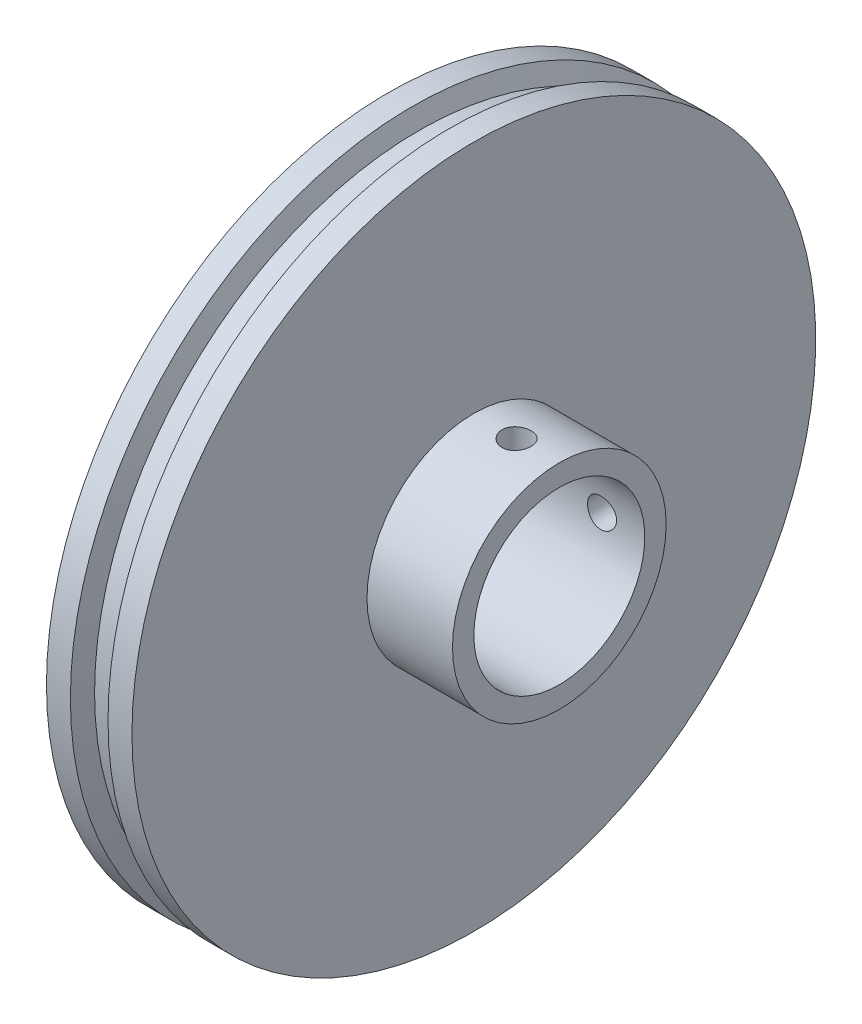
ISO-10303-21;
HEADER;
FILE_DESCRIPTION(('STEP AP214'),'2;1');
FILE_NAME('part.step','',(''),(''),'','','');
FILE_SCHEMA(('AUTOMOTIVE_DESIGN { 1 0 10303 214 1 1 1 1 }'));
ENDSEC;
DATA;
#1=APPLICATION_CONTEXT('core data for automotive mechanical design processes');
#2=APPLICATION_PROTOCOL_DEFINITION('international standard','automotive_design',2000,#1);
#3=PRODUCT_CONTEXT('',#1,'mechanical');
#4=PRODUCT('Part','Part','',(#3));
#5=PRODUCT_RELATED_PRODUCT_CATEGORY('part','',(#4));
#6=PRODUCT_DEFINITION_FORMATION('','',#4);
#7=PRODUCT_DEFINITION_CONTEXT('part definition',#1,'design');
#8=PRODUCT_DEFINITION('design','',#6,#7);
#9=PRODUCT_DEFINITION_SHAPE('','',#8);
#10=(LENGTH_UNIT() NAMED_UNIT(*) SI_UNIT(.MILLI.,.METRE.));
#11=(NAMED_UNIT(*) PLANE_ANGLE_UNIT() SI_UNIT($,.RADIAN.));
#12=(NAMED_UNIT(*) SI_UNIT($,.STERADIAN.) SOLID_ANGLE_UNIT());
#13=UNCERTAINTY_MEASURE_WITH_UNIT(LENGTH_MEASURE(1.E-05),#10,'distance_accuracy_value','');
#14=(GEOMETRIC_REPRESENTATION_CONTEXT(3) GLOBAL_UNCERTAINTY_ASSIGNED_CONTEXT((#13)) GLOBAL_UNIT_ASSIGNED_CONTEXT((#10,
#11,#12)) REPRESENTATION_CONTEXT('',''));
#15=CARTESIAN_POINT('',(0.,0.,0.));
#16=DIRECTION('',(0.,0.,1.));
#17=DIRECTION('',(1.,0.,0.));
#18=AXIS2_PLACEMENT_3D('',#15,#16,#17);
#19=CARTESIAN_POINT('',(-5.,0.,0.));
#20=DIRECTION('',(-1.,0.,0.));
#21=DIRECTION('',(0.,0.,1.));
#22=AXIS2_PLACEMENT_3D('',#19,#20,#21);
#23=CYLINDRICAL_SURFACE('',#22,12.5);
#24=CARTESIAN_POINT('',(5.,0.,0.));
#25=DIRECTION('',(-1.,0.,0.));
#26=DIRECTION('',(0.,0.,1.));
#27=AXIS2_PLACEMENT_3D('',#24,#25,#26);
#28=CIRCLE('',#27,12.5);
#29=CARTESIAN_POINT('',(5.,0.,12.5));
#30=VERTEX_POINT('',#29);
#31=EDGE_CURVE('E81',#30,#30,#28,.T.);
#32=ORIENTED_EDGE('',*,*,#31,.F.);
#33=EDGE_LOOP('',(#32));
#34=FACE_BOUND('',#33,.T.);
#35=CARTESIAN_POINT('',(15.,0.,0.));
#36=DIRECTION('',(-1.,0.,0.));
#37=DIRECTION('',(0.,0.,1.));
#38=AXIS2_PLACEMENT_3D('',#35,#36,#37);
#39=CIRCLE('',#38,12.5);
#40=CARTESIAN_POINT('',(15.,0.,12.5));
#41=VERTEX_POINT('',#40);
#42=EDGE_CURVE('E10',#41,#41,#39,.T.);
#43=ORIENTED_EDGE('',*,*,#42,.T.);
#44=EDGE_LOOP('',(#43));
#45=FACE_BOUND('',#44,.T.);
#46=CARTESIAN_POINT('',(8.3,12.5,0.));
#47=CARTESIAN_POINT('',(8.30000399049848,12.4999985824937,0.0950193693737273));
#48=CARTESIAN_POINT('',(8.30799335860235,12.4989051524507,0.190096346810551));
#49=CARTESIAN_POINT('',(8.33973558100916,12.4946484420949,0.377599668031956));
#50=CARTESIAN_POINT('',(8.36350443099154,12.4914830614891,0.470023222755468));
#51=CARTESIAN_POINT('',(8.42608811753651,12.4834386800685,0.649478453993375));
#52=CARTESIAN_POINT('',(8.46489230343678,12.4785608925101,0.73651389681058));
#53=CARTESIAN_POINT('',(8.55642067336079,12.4676327325641,0.902822437619665));
#54=CARTESIAN_POINT('',(8.60914266070609,12.461582545259,0.982096757862896));
#55=CARTESIAN_POINT('',(8.72737428453399,12.4489401706774,1.1311609905647));
#56=CARTESIAN_POINT('',(8.79295610205747,12.4423450516135,1.20089340927839));
#57=CARTESIAN_POINT('',(8.93489058333537,12.4293794703064,1.32839884646825));
#58=CARTESIAN_POINT('',(9.01124382407019,12.4230090201206,1.38617122388536));
#59=CARTESIAN_POINT('',(9.17293294201966,12.4111854302546,1.48833501602162));
#60=CARTESIAN_POINT('',(9.25830363935377,12.4057360746105,1.53267179858357));
#61=CARTESIAN_POINT('',(9.43536596920943,12.3964109917819,1.60635685826283));
#62=CARTESIAN_POINT('',(9.5270573184181,12.3925351941187,1.63570580669007));
#63=CARTESIAN_POINT('',(9.71355783465852,12.3868244616918,1.67840568904312));
#64=CARTESIAN_POINT('',(9.80834424651759,12.3849770693856,1.69185431515497));
#65=CARTESIAN_POINT('',(9.9988451896524,12.3834943395339,1.70267423628677));
#66=CARTESIAN_POINT('',(10.0945596767459,12.3838588971968,1.70004629293772));
#67=CARTESIAN_POINT('',(10.2835151005745,12.3867474777825,1.6788677145159));
#68=CARTESIAN_POINT('',(10.3767684103706,12.389256838664,1.66042518638892));
#69=CARTESIAN_POINT('',(10.5588443269562,12.3961294042073,1.60830986035059));
#70=CARTESIAN_POINT('',(10.647666828938,12.4004926526983,1.5746367023588));
#71=CARTESIAN_POINT('',(10.8186927336821,12.4105978157081,1.49290135454795));
#72=CARTESIAN_POINT('',(10.900873649633,12.4163441716624,1.44479268408233));
#73=CARTESIAN_POINT('',(11.0560369845012,12.4285647481879,1.33558512659794));
#74=CARTESIAN_POINT('',(11.1290189056233,12.4350390081132,1.27448553706776));
#75=CARTESIAN_POINT('',(11.264339663579,12.4480509280862,1.14043378959507));
#76=CARTESIAN_POINT('',(11.3265863165472,12.4545886726739,1.06738854593132));
#77=CARTESIAN_POINT('',(11.4379501383685,12.4669414130603,0.911838118562529));
#78=CARTESIAN_POINT('',(11.4870672666848,12.4727564066275,0.829332905651348));
#79=CARTESIAN_POINT('',(11.5707797967884,12.483013039657,0.657129787303393));
#80=CARTESIAN_POINT('',(11.6053688667713,12.4874540800839,0.567428765939401));
#81=CARTESIAN_POINT('',(11.6589673436249,12.4944571938052,0.383417754602683));
#82=CARTESIAN_POINT('',(11.6779776148745,12.4970193713461,0.289108020648868));
#83=CARTESIAN_POINT('',(11.6997580896896,12.4999624166332,0.099353143737758));
#84=CARTESIAN_POINT('',(11.7026551736488,12.5003603259693,0.00392281856572002));
#85=CARTESIAN_POINT('',(11.6924626868127,12.4989761709545,-0.186062088343098));
#86=CARTESIAN_POINT('',(11.6793735206688,12.4971941617827,-0.280616692185505));
#87=CARTESIAN_POINT('',(11.6376855428029,12.4916609697489,-0.465787556296885));
#88=CARTESIAN_POINT('',(11.6091477811237,12.4879175399217,-0.556417812371648));
#89=CARTESIAN_POINT('',(11.537436545087,12.478880270856,-0.731606674242914));
#90=CARTESIAN_POINT('',(11.4942624921698,12.47358637033,-0.816165039862857));
#91=CARTESIAN_POINT('',(11.3942011480688,12.4619950790423,-0.977372840274131));
#92=CARTESIAN_POINT('',(11.3372324452297,12.455691809023,-1.05397131280997));
#93=CARTESIAN_POINT('',(11.211313337348,12.4428038405337,-1.19656515527526));
#94=CARTESIAN_POINT('',(11.1423623653937,12.4362191287592,-1.26256002323669));
#95=CARTESIAN_POINT('',(10.9938745408483,12.4234572170661,-1.38252830907401));
#96=CARTESIAN_POINT('',(10.9142691068428,12.4172830816708,-1.43641721633323));
#97=CARTESIAN_POINT('',(10.7470621534232,12.4060934325306,-1.53005854518823));
#98=CARTESIAN_POINT('',(10.6594608185572,12.4010778920545,-1.56981129294775));
#99=CARTESIAN_POINT('',(10.4790127566732,12.3927947776081,-1.63391747298213));
#100=CARTESIAN_POINT('',(10.3861827355514,12.3895219509384,-1.65831722146991));
#101=CARTESIAN_POINT('',(10.1976952821839,12.3850802367668,-1.69117325627899));
#102=CARTESIAN_POINT('',(10.1020380081,12.3839112317988,-1.69963043274914));
#103=CARTESIAN_POINT('',(9.9114527750082,12.383813359009,-1.700342891897));
#104=CARTESIAN_POINT('',(9.81652529481145,12.3848661289696,-1.69273097999286));
#105=CARTESIAN_POINT('',(9.6293129579314,12.3890535297788,-1.66180397404756));
#106=CARTESIAN_POINT('',(9.53702809980375,12.3921881594894,-1.63848888858925));
#107=CARTESIAN_POINT('',(9.35774624949746,12.4001800965893,-1.57686121095053));
#108=CARTESIAN_POINT('',(9.27074659781941,12.4050365290199,-1.53855623507271));
#109=CARTESIAN_POINT('',(9.10438783045148,12.415926146482,-1.44804917472723));
#110=CARTESIAN_POINT('',(9.02502887946664,12.4219593568718,-1.39584679077452));
#111=CARTESIAN_POINT('',(8.87552693820758,12.4345823449606,-1.27853812678782));
#112=CARTESIAN_POINT('',(8.80546177668758,12.4411761460865,-1.21333308331974));
#113=CARTESIAN_POINT('',(8.6772188219195,12.4541426300155,-1.07207782751908));
#114=CARTESIAN_POINT('',(8.6190438167913,12.4605152606662,-0.99602507859291));
#115=CARTESIAN_POINT('',(8.51600454347844,12.4723535628891,-0.834836006102762));
#116=CARTESIAN_POINT('',(8.47120129412887,12.4778150281094,-0.74966038144764));
#117=CARTESIAN_POINT('',(8.3966005793095,12.4871737590591,-0.572963876241477));
#118=CARTESIAN_POINT('',(8.36678712612197,12.4910726904407,-0.481449875112423));
#119=CARTESIAN_POINT('',(8.32999391075147,12.4959478797449,-0.324573117820287));
#120=CARTESIAN_POINT('',(8.31876278159852,12.4974598558217,-0.260191415281782));
#121=CARTESIAN_POINT('',(8.30376449010305,12.4994863982821,-0.130548868797499));
#122=CARTESIAN_POINT('',(8.29999725811908,12.5000009739719,-0.065288033060141));
#123=CARTESIAN_POINT('',(8.3,12.5,0.));
#124=B_SPLINE_CURVE_WITH_KNOTS('',3,(#46,#47,#48,#49,#50,#51,#52,#53,#54,#55,#56,#57,#58,#59,
#60,#61,#62,#63,#64,#65,#66,#67,#68,#69,#70,#71,#72,#73,#74,#75,#76,#77,#78,#79,#80,#81,#82,#83,
#84,#85,#86,#87,#88,#89,#90,#91,#92,#93,#94,#95,#96,#97,#98,#99,#100,#101,#102,#103,#104,#105,
#106,#107,#108,#109,#110,#111,#112,#113,#114,#115,#116,#117,#118,#119,#120,#121,#122,#123),
.UNSPECIFIED.,.T.,.F.,(4,2,2,2,2,2,2,2,2,2,2,2,2,2,2,2,2,2,2,2,2,2,2,2,2,2,2,2,2,2,2,2,2,2,2,2,
2,2,4),(0.,0.284819593615374,0.56992835095583,0.854835512412447,1.13969773317749,
1.42620715431877,1.71273192841171,2.00040660874572,2.28806840290729,2.57395345239702,
2.85982495812473,3.14375771237637,3.42769717967764,3.712560892306,3.9974400134613,
4.28465522208686,4.57187131746728,4.85921246147866,5.14653766148729,5.43159713304083,
5.71664938918519,6.00058330751292,6.28452845080429,6.57019204001725,6.85586914838449,
7.14348251733643,7.4310892497516,7.71782413052423,8.00454300106438,8.28890152089469,
8.57325988530359,8.85747395558084,9.14169415108319,9.42816158283325,9.71469611138847,
10.0025188538507,10.2900339575411,10.4857359988361,10.6814362141364),.UNSPECIFIED.);
#125=CARTESIAN_POINT('',(8.3,12.5,0.));
#126=VERTEX_POINT('',#125);
#127=EDGE_CURVE('E59',#126,#126,#124,.T.);
#128=ORIENTED_EDGE('',*,*,#127,.F.);
#129=EDGE_LOOP('',(#128));
#130=FACE_BOUND('',#129,.T.);
#131=CARTESIAN_POINT('',(8.3,0.,-12.5));
#132=CARTESIAN_POINT('',(8.30000399049848,0.0950193693736837,-12.4999985824937));
#133=CARTESIAN_POINT('',(8.30799335860235,0.190096346810507,-12.4989051524507));
#134=CARTESIAN_POINT('',(8.33973558100916,0.377599668031912,-12.4946484420949));
#135=CARTESIAN_POINT('',(8.36350443099154,0.470023222755424,-12.4914830614891));
#136=CARTESIAN_POINT('',(8.42608811753651,0.649478453993332,-12.4834386800686));
#137=CARTESIAN_POINT('',(8.46489230343678,0.736513896810536,-12.4785608925101));
#138=CARTESIAN_POINT('',(8.55642067336079,0.902822437619622,-12.4676327325641));
#139=CARTESIAN_POINT('',(8.60914266070609,0.982096757862853,-12.461582545259));
#140=CARTESIAN_POINT('',(8.72737428453399,1.13116099056465,-12.4489401706774));
#141=CARTESIAN_POINT('',(8.79295610205747,1.20089340927835,-12.4423450516135));
#142=CARTESIAN_POINT('',(8.93489058333537,1.32839884646821,-12.4293794703064));
#143=CARTESIAN_POINT('',(9.01124382407019,1.38617122388531,-12.4230090201206));
#144=CARTESIAN_POINT('',(9.17293294201966,1.48833501602157,-12.4111854302546));
#145=CARTESIAN_POINT('',(9.25830363935377,1.53267179858353,-12.4057360746105));
#146=CARTESIAN_POINT('',(9.43536596920943,1.60635685826278,-12.3964109917819));
#147=CARTESIAN_POINT('',(9.5270573184181,1.63570580669003,-12.3925351941188));
#148=CARTESIAN_POINT('',(9.71355783465852,1.67840568904308,-12.3868244616918));
#149=CARTESIAN_POINT('',(9.80834424651759,1.69185431515493,-12.3849770693856));
#150=CARTESIAN_POINT('',(9.9988451896524,1.70267423628672,-12.3834943395339));
#151=CARTESIAN_POINT('',(10.0945596767459,1.70004629293768,-12.3838588971968));
#152=CARTESIAN_POINT('',(10.2835151005745,1.67886771451586,-12.3867474777825));
#153=CARTESIAN_POINT('',(10.3767684103706,1.66042518638888,-12.389256838664));
#154=CARTESIAN_POINT('',(10.5588443269562,1.60830986035055,-12.3961294042073));
#155=CARTESIAN_POINT('',(10.647666828938,1.57463670235876,-12.4004926526983));
#156=CARTESIAN_POINT('',(10.8186927336821,1.49290135454791,-12.4105978157081));
#157=CARTESIAN_POINT('',(10.900873649633,1.44479268408229,-12.4163441716624));
#158=CARTESIAN_POINT('',(11.0560369845012,1.33558512659789,-12.4285647481879));
#159=CARTESIAN_POINT('',(11.1290189056233,1.27448553706771,-12.4350390081132));
#160=CARTESIAN_POINT('',(11.264339663579,1.14043378959502,-12.4480509280862));
#161=CARTESIAN_POINT('',(11.3265863165472,1.06738854593127,-12.454588672674));
#162=CARTESIAN_POINT('',(11.4379501383685,0.911838118562486,-12.4669414130603));
#163=CARTESIAN_POINT('',(11.4870672666848,0.829332905651305,-12.4727564066275));
#164=CARTESIAN_POINT('',(11.5707797967884,0.657129787303349,-12.483013039657));
#165=CARTESIAN_POINT('',(11.6053688667713,0.567428765939357,-12.4874540800839));
#166=CARTESIAN_POINT('',(11.6589673436249,0.383417754602639,-12.4944571938052));
#167=CARTESIAN_POINT('',(11.6779776148745,0.289108020648824,-12.4970193713461));
#168=CARTESIAN_POINT('',(11.6997580896896,0.0993531437377146,-12.4999624166332));
#169=CARTESIAN_POINT('',(11.7026551736488,0.00392281856567651,-12.5003603259693));
#170=CARTESIAN_POINT('',(11.6924626868127,-0.186062088343141,-12.4989761709545));
#171=CARTESIAN_POINT('',(11.6793735206688,-0.280616692185548,-12.4971941617827));
#172=CARTESIAN_POINT('',(11.6376855428029,-0.465787556296929,-12.4916609697489));
#173=CARTESIAN_POINT('',(11.6091477811237,-0.556417812371691,-12.4879175399217));
#174=CARTESIAN_POINT('',(11.537436545087,-0.731606674242958,-12.478880270856));
#175=CARTESIAN_POINT('',(11.4942624921698,-0.8161650398629,-12.47358637033));
#176=CARTESIAN_POINT('',(11.3942011480688,-0.977372840274175,-12.4619950790423));
#177=CARTESIAN_POINT('',(11.3372324452297,-1.05397131281001,-12.455691809023));
#178=CARTESIAN_POINT('',(11.211313337348,-1.19656515527531,-12.4428038405337));
#179=CARTESIAN_POINT('',(11.1423623653937,-1.26256002323674,-12.4362191287591));
#180=CARTESIAN_POINT('',(10.9938745408483,-1.38252830907405,-12.4234572170661));
#181=CARTESIAN_POINT('',(10.9142691068428,-1.43641721633328,-12.4172830816708));
#182=CARTESIAN_POINT('',(10.7470621534232,-1.53005854518827,-12.4060934325306));
#183=CARTESIAN_POINT('',(10.6594608185572,-1.56981129294779,-12.4010778920545));
#184=CARTESIAN_POINT('',(10.4790127566732,-1.63391747298217,-12.3927947776081));
#185=CARTESIAN_POINT('',(10.3861827355514,-1.65831722146995,-12.3895219509384));
#186=CARTESIAN_POINT('',(10.1976952821839,-1.69117325627904,-12.3850802367668));
#187=CARTESIAN_POINT('',(10.1020380081,-1.69963043274918,-12.3839112317988));
#188=CARTESIAN_POINT('',(9.9114527750082,-1.70034289189704,-12.383813359009));
#189=CARTESIAN_POINT('',(9.81652529481145,-1.69273097999291,-12.3848661289696));
#190=CARTESIAN_POINT('',(9.6293129579314,-1.6618039740476,-12.3890535297788));
#191=CARTESIAN_POINT('',(9.53702809980375,-1.63848888858929,-12.3921881594894));
#192=CARTESIAN_POINT('',(9.35774624949746,-1.57686121095058,-12.4001800965892));
#193=CARTESIAN_POINT('',(9.27074659781941,-1.53855623507276,-12.4050365290199));
#194=CARTESIAN_POINT('',(9.10438783045148,-1.44804917472727,-12.415926146482));
#195=CARTESIAN_POINT('',(9.02502887946664,-1.39584679077457,-12.4219593568718));
#196=CARTESIAN_POINT('',(8.87552693820758,-1.27853812678787,-12.4345823449606));
#197=CARTESIAN_POINT('',(8.80546177668758,-1.21333308331979,-12.4411761460865));
#198=CARTESIAN_POINT('',(8.6772188219195,-1.07207782751913,-12.4541426300155));
#199=CARTESIAN_POINT('',(8.6190438167913,-0.996025078592954,-12.4605152606662));
#200=CARTESIAN_POINT('',(8.51600454347844,-0.834836006102806,-12.4723535628891));
#201=CARTESIAN_POINT('',(8.47120129412887,-0.749660381447684,-12.4778150281094));
#202=CARTESIAN_POINT('',(8.3966005793095,-0.572963876241521,-12.4871737590591));
#203=CARTESIAN_POINT('',(8.36678712612197,-0.481449875112467,-12.4910726904407));
#204=CARTESIAN_POINT('',(8.32999391075147,-0.324573117820331,-12.4959478797449));
#205=CARTESIAN_POINT('',(8.31876278159852,-0.260191415281826,-12.4974598558217));
#206=CARTESIAN_POINT('',(8.30376449010305,-0.130548868797543,-12.4994863982821));
#207=CARTESIAN_POINT('',(8.29999725811908,-0.0652880330601847,-12.5000009739719));
#208=CARTESIAN_POINT('',(8.3,0.,-12.5));
#209=B_SPLINE_CURVE_WITH_KNOTS('',3,(#131,#132,#133,#134,#135,#136,#137,#138,#139,#140,#141,
#142,#143,#144,#145,#146,#147,#148,#149,#150,#151,#152,#153,#154,#155,#156,#157,#158,#159,#160,
#161,#162,#163,#164,#165,#166,#167,#168,#169,#170,#171,#172,#173,#174,#175,#176,#177,#178,#179,
#180,#181,#182,#183,#184,#185,#186,#187,#188,#189,#190,#191,#192,#193,#194,#195,#196,#197,#198,
#199,#200,#201,#202,#203,#204,#205,#206,#207,#208),.UNSPECIFIED.,.T.,.F.,(4,2,2,2,2,2,2,2,2,2,2,
2,2,2,2,2,2,2,2,2,2,2,2,2,2,2,2,2,2,2,2,2,2,2,2,2,2,2,4),(0.,0.284819593615374,0.56992835095583,
0.854835512412447,1.13969773317749,1.42620715431877,1.71273192841171,2.00040660874572,
2.28806840290729,2.57395345239702,2.85982495812473,3.14375771237637,3.42769717967764,
3.712560892306,3.9974400134613,4.28465522208686,4.57187131746728,4.85921246147866,
5.14653766148729,5.43159713304083,5.71664938918519,6.00058330751292,6.28452845080429,
6.57019204001725,6.85586914838449,7.14348251733643,7.43108924975161,7.71782413052423,
8.00454300106438,8.2889015208947,8.57325988530359,8.85747395558084,9.14169415108319,
9.42816158283325,9.71469611138847,10.0025188538507,10.2900339575411,10.4857359988361,
10.6814362141364),.UNSPECIFIED.);
#210=CARTESIAN_POINT('',(8.3,0.,-12.5));
#211=VERTEX_POINT('',#210);
#212=EDGE_CURVE('E60',#211,#211,#209,.T.);
#213=ORIENTED_EDGE('',*,*,#212,.F.);
#214=EDGE_LOOP('',(#213));
#215=FACE_BOUND('',#214,.T.);
#216=ADVANCED_FACE('F32',(#34,#45,#130,#215),#23,.T.);
#217=CARTESIAN_POINT('',(-5.,0.,0.));
#218=DIRECTION('',(-1.,0.,0.));
#219=DIRECTION('',(0.,0.,1.));
#220=AXIS2_PLACEMENT_3D('',#217,#218,#219);
#221=CYLINDRICAL_SURFACE('',#220,10.);
#222=CARTESIAN_POINT('',(15.,0.,0.));
#223=DIRECTION('',(-1.,0.,0.));
#224=DIRECTION('',(0.,0.,1.));
#225=AXIS2_PLACEMENT_3D('',#222,#223,#224);
#226=CIRCLE('',#225,10.);
#227=CARTESIAN_POINT('',(15.,0.,10.));
#228=VERTEX_POINT('',#227);
#229=EDGE_CURVE('E45',#228,#228,#226,.T.);
#230=ORIENTED_EDGE('',*,*,#229,.F.);
#231=EDGE_LOOP('',(#230));
#232=FACE_BOUND('',#231,.T.);
#233=CARTESIAN_POINT('',(-5.,0.,0.));
#234=DIRECTION('',(-1.,0.,0.));
#235=DIRECTION('',(0.,0.,1.));
#236=AXIS2_PLACEMENT_3D('',#233,#234,#235);
#237=CIRCLE('',#236,10.);
#238=CARTESIAN_POINT('',(-5.,0.,10.));
#239=VERTEX_POINT('',#238);
#240=EDGE_CURVE('E50',#239,#239,#237,.T.);
#241=ORIENTED_EDGE('',*,*,#240,.T.);
#242=EDGE_LOOP('',(#241));
#243=FACE_BOUND('',#242,.T.);
#244=CARTESIAN_POINT('',(8.3,10.,0.));
#245=CARTESIAN_POINT('',(8.30000377426823,9.99999835850477,-0.0947576878946055));
#246=CARTESIAN_POINT('',(8.3079494293732,9.99863913653262,-0.189566391791717));
#247=CARTESIAN_POINT('',(8.33950779581302,9.99334783512617,-0.376522793597834));
#248=CARTESIAN_POINT('',(8.3631347336332,9.98941341945108,-0.468667995816793));
#249=CARTESIAN_POINT('',(8.4253200785672,9.97941284762061,-0.647565634171713));
#250=CARTESIAN_POINT('',(8.46386607640266,9.97334846350343,-0.734322482783481));
#251=CARTESIAN_POINT('',(8.55476244084402,9.95975405257941,-0.900126684803733));
#252=CARTESIAN_POINT('',(8.60711129965871,9.95222418588187,-0.979174878995801));
#253=CARTESIAN_POINT('',(8.72468015800242,9.93644939291957,-1.12811339489271));
#254=CARTESIAN_POINT('',(8.79001042782126,9.92819870569956,-1.19791607072673));
#255=CARTESIAN_POINT('',(8.93145028967449,9.91195606359551,-1.3256248419945));
#256=CARTESIAN_POINT('',(9.00756057528767,9.90396412539988,-1.38353017137327));
#257=CARTESIAN_POINT('',(9.16900471159843,9.88908804024087,-1.48615381918914));
#258=CARTESIAN_POINT('',(9.25439464291669,9.88221133503736,-1.53078508643947));
#259=CARTESIAN_POINT('',(9.43159610594252,9.87042444664235,-1.60503692511557));
#260=CARTESIAN_POINT('',(9.52340718532692,9.86551412509698,-1.63465855265173));
#261=CARTESIAN_POINT('',(9.70991431831559,9.85827341734443,-1.67777332304485));
#262=CARTESIAN_POINT('',(9.80457437839511,9.85591880382118,-1.69141802151835));
#263=CARTESIAN_POINT('',(9.99486742648253,9.85398286044504,-1.70266159018217));
#264=CARTESIAN_POINT('',(10.0905003423385,9.8544013264024,-1.70026164178552));
#265=CARTESIAN_POINT('',(10.2789401126245,9.85794215005271,-1.67960740432418));
#266=CARTESIAN_POINT('',(10.3717662886004,9.86103541731158,-1.66152368158915));
#267=CARTESIAN_POINT('',(10.553047603891,9.86953175017028,-1.6102830462488));
#268=CARTESIAN_POINT('',(10.641502587653,9.87493489790323,-1.57712559765967));
#269=CARTESIAN_POINT('',(10.8120394633763,9.88747346302157,-1.49650673760764));
#270=CARTESIAN_POINT('',(10.8940873626616,9.89461738721263,-1.44897479731415));
#271=CARTESIAN_POINT('',(11.0491073586138,9.90982670315991,-1.34100625557331));
#272=CARTESIAN_POINT('',(11.1220786930608,9.91789217219545,-1.2805685715006));
#273=CARTESIAN_POINT('',(11.2578612153225,9.93416346380999,-1.14757629513502));
#274=CARTESIAN_POINT('',(11.320529165259,9.94236975461281,-1.07487542689003));
#275=CARTESIAN_POINT('',(11.4327985550483,9.95790194047775,-0.91991440278867));
#276=CARTESIAN_POINT('',(11.482399904278,9.96522782943365,-0.837654180639251));
#277=CARTESIAN_POINT('',(11.5671423471008,9.97818481552786,-0.665772592595594));
#278=CARTESIAN_POINT('',(11.6022704457055,9.98381438839473,-0.576144697761931));
#279=CARTESIAN_POINT('',(11.6569344968132,9.99273228163516,-0.392144072691741));
#280=CARTESIAN_POINT('',(11.6764718070531,9.9960208058782,-0.297771756388136));
#281=CARTESIAN_POINT('',(11.6992047217622,9.99985857062862,-0.108195402995361));
#282=CARTESIAN_POINT('',(11.7025969038369,10.0004407604978,-0.0130155823423567));
#283=CARTESIAN_POINT('',(11.6934678440613,9.99889062262385,0.176552208617399));
#284=CARTESIAN_POINT('',(11.6809472401301,9.99675840369713,0.270940210514255));
#285=CARTESIAN_POINT('',(11.6405115192946,9.9900394441558,0.455635354346481));
#286=CARTESIAN_POINT('',(11.612694051989,9.98546827833647,0.545964490519938));
#287=CARTESIAN_POINT('',(11.5425585774746,9.97438190041171,0.720677070626036));
#288=CARTESIAN_POINT('',(11.5002397288841,9.96786657550744,0.805060169222211));
#289=CARTESIAN_POINT('',(11.4018548591596,9.95353279680435,0.966336947941808));
#290=CARTESIAN_POINT('',(11.3456664517532,9.94570295183439,1.04315493575005));
#291=CARTESIAN_POINT('',(11.2213053793328,9.92964218696026,1.18634178293015));
#292=CARTESIAN_POINT('',(11.1531318063952,9.92141123670495,1.25270984995668));
#293=CARTESIAN_POINT('',(11.0058526439188,9.90536897279411,1.37384438851324));
#294=CARTESIAN_POINT('',(10.9266369481539,9.89756315078007,1.42847783237172));
#295=CARTESIAN_POINT('',(10.7600369358385,9.88335868818869,1.52366227424996));
#296=CARTESIAN_POINT('',(10.6726528858138,9.87696000172068,1.56421373154811));
#297=CARTESIAN_POINT('',(10.4925634017548,9.86633579141612,1.62988570006915));
#298=CARTESIAN_POINT('',(10.3998823886925,9.86210106805335,1.65507162400973));
#299=CARTESIAN_POINT('',(10.2115270724541,9.85626147937876,1.68950285881336));
#300=CARTESIAN_POINT('',(10.1158530418926,9.8546563752585,1.69874961719306));
#301=CARTESIAN_POINT('',(9.92555649227636,9.85426833565764,1.70099842807246));
#302=CARTESIAN_POINT('',(9.83093645764805,9.85544901199148,1.69420993359398));
#303=CARTESIAN_POINT('',(9.64420600021117,9.86041960844602,1.66503470775952));
#304=CARTESIAN_POINT('',(9.55209556830815,9.86420951910991,1.64264803293703));
#305=CARTESIAN_POINT('',(9.37308483455114,9.87395749749249,1.58299342959769));
#306=CARTESIAN_POINT('',(9.28617812738393,9.87991283309771,1.54574424734568));
#307=CARTESIAN_POINT('',(9.11981367766731,9.893323172577,1.4574437045791));
#308=CARTESIAN_POINT('',(9.0403563292574,9.90077825573591,1.40639161431834));
#309=CARTESIAN_POINT('',(8.89008922946276,9.91646308896847,1.29118985102455));
#310=CARTESIAN_POINT('',(8.81939828755894,9.92470126313323,1.22688632923809));
#311=CARTESIAN_POINT('',(8.68973876498284,9.94095750314495,1.0873309849141));
#312=CARTESIAN_POINT('',(8.63077289037744,9.94897551781341,1.01207664192477));
#313=CARTESIAN_POINT('',(8.52584704213854,9.96395520458386,0.852109586538182));
#314=CARTESIAN_POINT('',(8.47998397145125,9.9709088381394,0.767332551982327));
#315=CARTESIAN_POINT('',(8.40322128664598,9.98289805427614,0.591192591150797));
#316=CARTESIAN_POINT('',(8.37230689784042,9.98793552965722,0.499836270638972));
#317=CARTESIAN_POINT('',(8.33296367751762,9.99443647001914,0.340114573147608));
#318=CARTESIAN_POINT('',(8.32062229455269,9.99651154722548,0.272710808068802));
#319=CARTESIAN_POINT('',(8.30413916773769,9.99929389258055,0.136880224020146));
#320=CARTESIAN_POINT('',(8.29999727344991,10.0000011858243,0.06845342384334));
#321=CARTESIAN_POINT('',(8.3,10.,0.));
#322=B_SPLINE_CURVE_WITH_KNOTS('',3,(#244,#245,#246,#247,#248,#249,#250,#251,#252,#253,#254,
#255,#256,#257,#258,#259,#260,#261,#262,#263,#264,#265,#266,#267,#268,#269,#270,#271,#272,#273,
#274,#275,#276,#277,#278,#279,#280,#281,#282,#283,#284,#285,#286,#287,#288,#289,#290,#291,#292,
#293,#294,#295,#296,#297,#298,#299,#300,#301,#302,#303,#304,#305,#306,#307,#308,#309,#310,#311,
#312,#313,#314,#315,#316,#317,#318,#319,#320,#321),.UNSPECIFIED.,.T.,.F.,(4,2,2,2,2,2,2,2,2,2,2,
2,2,2,2,2,2,2,2,2,2,2,2,2,2,2,2,2,2,2,2,2,2,2,2,2,2,2,4),(0.,0.284022828438538,
0.568303682958858,0.852348586605787,1.13636247471906,1.42290084405774,1.70945765745934,
1.99785424638948,2.28623054029933,2.57184857573334,2.85744558052973,3.1399750242267,
3.42251451474645,3.70646342600058,3.99043616626787,4.27807283462103,4.56571149782111,
4.85360786111795,5.14147914998386,5.42583629106418,5.71018203306508,5.99273333952094,
6.27530104260755,6.56045734817342,6.8456352647715,7.13389286809598,7.42214106913035,
7.70915344460831,7.99613975365976,8.27939820754208,8.56265563479786,8.84555690967836,
9.1284731441973,9.41488053086675,9.70135394191365,9.98989417240833,10.2781486352408,
10.4833319001627,10.6885114005101),.UNSPECIFIED.);
#323=CARTESIAN_POINT('',(8.3,10.,0.));
#324=VERTEX_POINT('',#323);
#325=EDGE_CURVE('E53',#324,#324,#322,.T.);
#326=ORIENTED_EDGE('',*,*,#325,.F.);
#327=EDGE_LOOP('',(#326));
#328=FACE_BOUND('',#327,.T.);
#329=CARTESIAN_POINT('',(8.3,0.,-10.));
#330=CARTESIAN_POINT('',(8.30000377426823,-0.0947576878946405,-9.99999835850477));
#331=CARTESIAN_POINT('',(8.3079494293732,-0.189566391791752,-9.99863913653262));
#332=CARTESIAN_POINT('',(8.33950779581302,-0.376522793597869,-9.99334783512617));
#333=CARTESIAN_POINT('',(8.3631347336332,-0.468667995816828,-9.98941341945108));
#334=CARTESIAN_POINT('',(8.4253200785672,-0.647565634171747,-9.9794128476206));
#335=CARTESIAN_POINT('',(8.46386607640266,-0.734322482783515,-9.97334846350343));
#336=CARTESIAN_POINT('',(8.55476244084402,-0.900126684803768,-9.95975405257941));
#337=CARTESIAN_POINT('',(8.60711129965871,-0.979174878995836,-9.95222418588187));
#338=CARTESIAN_POINT('',(8.72468015800242,-1.12811339489274,-9.93644939291956));
#339=CARTESIAN_POINT('',(8.79001042782126,-1.19791607072676,-9.92819870569956));
#340=CARTESIAN_POINT('',(8.93145028967449,-1.32562484199454,-9.91195606359551));
#341=CARTESIAN_POINT('',(9.00756057528767,-1.38353017137331,-9.90396412539988));
#342=CARTESIAN_POINT('',(9.16900471159843,-1.48615381918918,-9.88908804024087));
#343=CARTESIAN_POINT('',(9.25439464291668,-1.5307850864395,-9.88221133503736));
#344=CARTESIAN_POINT('',(9.43159610594252,-1.6050369251156,-9.87042444664234));
#345=CARTESIAN_POINT('',(9.52340718532692,-1.63465855265176,-9.86551412509698));
#346=CARTESIAN_POINT('',(9.70991431831559,-1.67777332304488,-9.85827341734443));
#347=CARTESIAN_POINT('',(9.80457437839511,-1.69141802151839,-9.85591880382117));
#348=CARTESIAN_POINT('',(9.99486742648253,-1.70266159018221,-9.85398286044503));
#349=CARTESIAN_POINT('',(10.0905003423385,-1.70026164178555,-9.8544013264024));
#350=CARTESIAN_POINT('',(10.2789401126245,-1.67960740432421,-9.8579421500527));
#351=CARTESIAN_POINT('',(10.3717662886004,-1.66152368158919,-9.86103541731157));
#352=CARTESIAN_POINT('',(10.553047603891,-1.61028304624883,-9.86953175017027));
#353=CARTESIAN_POINT('',(10.641502587653,-1.5771255976597,-9.87493489790323));
#354=CARTESIAN_POINT('',(10.8120394633763,-1.49650673760767,-9.88747346302157));
#355=CARTESIAN_POINT('',(10.8940873626616,-1.44897479731419,-9.89461738721263));
#356=CARTESIAN_POINT('',(11.0491073586138,-1.34100625557335,-9.90982670315991));
#357=CARTESIAN_POINT('',(11.1220786930608,-1.28056857150064,-9.91789217219545));
#358=CARTESIAN_POINT('',(11.2578612153225,-1.14757629513505,-9.93416346380998));
#359=CARTESIAN_POINT('',(11.320529165259,-1.07487542689007,-9.94236975461281));
#360=CARTESIAN_POINT('',(11.4327985550483,-0.919914402788704,-9.95790194047774));
#361=CARTESIAN_POINT('',(11.482399904278,-0.837654180639286,-9.96522782943365));
#362=CARTESIAN_POINT('',(11.5671423471008,-0.665772592595629,-9.97818481552786));
#363=CARTESIAN_POINT('',(11.6022704457055,-0.576144697761966,-9.98381438839473));
#364=CARTESIAN_POINT('',(11.6569344968132,-0.392144072691776,-9.99273228163516));
#365=CARTESIAN_POINT('',(11.6764718070531,-0.297771756388171,-9.9960208058782));
#366=CARTESIAN_POINT('',(11.6992047217622,-0.108195402995396,-9.99985857062862));
#367=CARTESIAN_POINT('',(11.7025969038369,-0.0130155823423917,-10.0004407604978));
#368=CARTESIAN_POINT('',(11.6934678440613,0.176552208617364,-9.99889062262385));
#369=CARTESIAN_POINT('',(11.6809472401301,0.270940210514219,-9.99675840369713));
#370=CARTESIAN_POINT('',(11.6405115192946,0.455635354346446,-9.99003944415581));
#371=CARTESIAN_POINT('',(11.612694051989,0.545964490519903,-9.98546827833648));
#372=CARTESIAN_POINT('',(11.5425585774746,0.720677070626001,-9.97438190041171));
#373=CARTESIAN_POINT('',(11.5002397288841,0.805060169222176,-9.96786657550744));
#374=CARTESIAN_POINT('',(11.4018548591596,0.966336947941773,-9.95353279680435));
#375=CARTESIAN_POINT('',(11.3456664517532,1.04315493575002,-9.94570295183439));
#376=CARTESIAN_POINT('',(11.2213053793328,1.18634178293012,-9.92964218696027));
#377=CARTESIAN_POINT('',(11.1531318063952,1.25270984995664,-9.92141123670496));
#378=CARTESIAN_POINT('',(11.0058526439188,1.3738443885132,-9.90536897279412));
#379=CARTESIAN_POINT('',(10.9266369481539,1.42847783237168,-9.89756315078008));
#380=CARTESIAN_POINT('',(10.7600369358385,1.52366227424992,-9.88335868818869));
#381=CARTESIAN_POINT('',(10.6726528858138,1.56421373154807,-9.87696000172068));
#382=CARTESIAN_POINT('',(10.4925634017548,1.62988570006912,-9.86633579141612));
#383=CARTESIAN_POINT('',(10.3998823886925,1.6550716240097,-9.86210106805335));
#384=CARTESIAN_POINT('',(10.2115270724541,1.68950285881332,-9.85626147937876));
#385=CARTESIAN_POINT('',(10.1158530418926,1.69874961719303,-9.85465637525851));
#386=CARTESIAN_POINT('',(9.92555649227636,1.70099842807243,-9.85426833565765));
#387=CARTESIAN_POINT('',(9.83093645764805,1.69420993359395,-9.85544901199149));
#388=CARTESIAN_POINT('',(9.64420600021117,1.66503470775949,-9.86041960844603));
#389=CARTESIAN_POINT('',(9.55209556830815,1.642648032937,-9.86420951910992));
#390=CARTESIAN_POINT('',(9.37308483455114,1.58299342959766,-9.8739574974925));
#391=CARTESIAN_POINT('',(9.28617812738393,1.54574424734565,-9.87991283309772));
#392=CARTESIAN_POINT('',(9.11981367766731,1.45744370457907,-9.893323172577));
#393=CARTESIAN_POINT('',(9.0403563292574,1.40639161431831,-9.90077825573591));
#394=CARTESIAN_POINT('',(8.89008922946276,1.29118985102452,-9.91646308896848));
#395=CARTESIAN_POINT('',(8.81939828755894,1.22688632923805,-9.92470126313324));
#396=CARTESIAN_POINT('',(8.68973876498284,1.08733098491407,-9.94095750314496));
#397=CARTESIAN_POINT('',(8.63077289037744,1.01207664192473,-9.94897551781341));
#398=CARTESIAN_POINT('',(8.52584704213854,0.852109586538147,-9.96395520458386));
#399=CARTESIAN_POINT('',(8.47998397145125,0.767332551982293,-9.9709088381394));
#400=CARTESIAN_POINT('',(8.40322128664598,0.591192591150763,-9.98289805427614));
#401=CARTESIAN_POINT('',(8.37230689784042,0.499836270638938,-9.98793552965722));
#402=CARTESIAN_POINT('',(8.33296367751762,0.340114573147573,-9.99443647001914));
#403=CARTESIAN_POINT('',(8.32062229455269,0.272710808068767,-9.99651154722548));
#404=CARTESIAN_POINT('',(8.30413916773769,0.136880224020111,-9.99929389258055));
#405=CARTESIAN_POINT('',(8.29999727344991,0.0684534238433051,-10.0000011858243));
#406=CARTESIAN_POINT('',(8.3,0.,-10.));
#407=B_SPLINE_CURVE_WITH_KNOTS('',3,(#329,#330,#331,#332,#333,#334,#335,#336,#337,#338,#339,
#340,#341,#342,#343,#344,#345,#346,#347,#348,#349,#350,#351,#352,#353,#354,#355,#356,#357,#358,
#359,#360,#361,#362,#363,#364,#365,#366,#367,#368,#369,#370,#371,#372,#373,#374,#375,#376,#377,
#378,#379,#380,#381,#382,#383,#384,#385,#386,#387,#388,#389,#390,#391,#392,#393,#394,#395,#396,
#397,#398,#399,#400,#401,#402,#403,#404,#405,#406),.UNSPECIFIED.,.T.,.F.,(4,2,2,2,2,2,2,2,2,2,2,
2,2,2,2,2,2,2,2,2,2,2,2,2,2,2,2,2,2,2,2,2,2,2,2,2,2,2,4),(0.,0.284022828438538,
0.568303682958858,0.852348586605787,1.13636247471906,1.42290084405774,1.70945765745933,
1.99785424638948,2.28623054029932,2.57184857573334,2.85744558052973,3.1399750242267,
3.42251451474645,3.70646342600058,3.99043616626787,4.27807283462103,4.56571149782111,
4.85360786111795,5.14147914998385,5.42583629106418,5.71018203306508,5.99273333952094,
6.27530104260755,6.56045734817342,6.8456352647715,7.13389286809598,7.42214106913035,
7.70915344460831,7.99613975365975,8.27939820754208,8.56265563479786,8.84555690967836,
9.1284731441973,9.41488053086675,9.70135394191365,9.98989417240833,10.2781486352408,
10.4833319001627,10.6885114005101),.UNSPECIFIED.);
#408=CARTESIAN_POINT('',(8.3,0.,-10.));
#409=VERTEX_POINT('',#408);
#410=EDGE_CURVE('E36',#409,#409,#407,.T.);
#411=ORIENTED_EDGE('',*,*,#410,.F.);
#412=EDGE_LOOP('',(#411));
#413=FACE_BOUND('',#412,.T.);
#414=ADVANCED_FACE('F61',(#232,#243,#328,#413),#221,.F.);
#415=CARTESIAN_POINT('',(15.,12.5,0.));
#416=DIRECTION('',(-1.,0.,0.));
#417=DIRECTION('',(0.,0.,1.));
#418=AXIS2_PLACEMENT_3D('',#415,#416,#417);
#419=PLANE('',#418);
#420=ORIENTED_EDGE('',*,*,#42,.F.);
#421=EDGE_LOOP('',(#420));
#422=FACE_BOUND('',#421,.T.);
#423=ORIENTED_EDGE('',*,*,#229,.T.);
#424=EDGE_LOOP('',(#423));
#425=FACE_BOUND('',#424,.T.);
#426=ADVANCED_FACE('F113',(#422,#425),#419,.F.);
#427=CARTESIAN_POINT('',(-4.99999999999999,40.,0.));
#428=DIRECTION('',(1.,0.,0.));
#429=DIRECTION('',(0.,0.,-1.));
#430=AXIS2_PLACEMENT_3D('',#427,#428,#429);
#431=PLANE('',#430);
#432=ORIENTED_EDGE('',*,*,#240,.F.);
#433=EDGE_LOOP('',(#432));
#434=FACE_BOUND('',#433,.T.);
#435=CARTESIAN_POINT('',(-4.99999999999999,0.,0.));
#436=DIRECTION('',(-1.,0.,0.));
#437=DIRECTION('',(0.,0.,1.));
#438=AXIS2_PLACEMENT_3D('',#435,#436,#437);
#439=CIRCLE('',#438,40.);
#440=CARTESIAN_POINT('',(-4.99999999999999,0.,40.));
#441=VERTEX_POINT('',#440);
#442=EDGE_CURVE('E102',#441,#441,#439,.T.);
#443=ORIENTED_EDGE('',*,*,#442,.T.);
#444=EDGE_LOOP('',(#443));
#445=FACE_BOUND('',#444,.T.);
#446=ADVANCED_FACE('F109',(#434,#445),#431,.F.);
#447=CARTESIAN_POINT('',(-5.,0.,0.));
#448=DIRECTION('',(-1.,0.,0.));
#449=DIRECTION('',(0.,0.,1.));
#450=AXIS2_PLACEMENT_3D('',#447,#448,#449);
#451=CYLINDRICAL_SURFACE('',#450,40.);
#452=ORIENTED_EDGE('',*,*,#442,.F.);
#453=EDGE_LOOP('',(#452));
#454=FACE_BOUND('',#453,.T.);
#455=CARTESIAN_POINT('',(-2.19999999999999,0.,0.));
#456=DIRECTION('',(-1.,0.,0.));
#457=DIRECTION('',(0.,0.,1.));
#458=AXIS2_PLACEMENT_3D('',#455,#456,#457);
#459=CIRCLE('',#458,40.);
#460=CARTESIAN_POINT('',(-2.19999999999999,0.,40.));
#461=VERTEX_POINT('',#460);
#462=EDGE_CURVE('E99',#461,#461,#459,.T.);
#463=ORIENTED_EDGE('',*,*,#462,.T.);
#464=EDGE_LOOP('',(#463));
#465=FACE_BOUND('',#464,.T.);
#466=ADVANCED_FACE('F112',(#454,#465),#451,.T.);
#467=CARTESIAN_POINT('',(-1.37157287525382,0.,0.));
#468=DIRECTION('',(-1.,0.,0.));
#469=DIRECTION('',(0.,0.,1.));
#470=AXIS2_PLACEMENT_3D('',#467,#468,#469);
#471=CONICAL_SURFACE('',#470,38.,1.17809724509618);
#472=ORIENTED_EDGE('',*,*,#462,.F.);
#473=EDGE_LOOP('',(#472));
#474=FACE_BOUND('',#473,.T.);
#475=CARTESIAN_POINT('',(-1.37157287525382,0.,0.));
#476=DIRECTION('',(-1.,0.,0.));
#477=DIRECTION('',(0.,0.,1.));
#478=AXIS2_PLACEMENT_3D('',#475,#476,#477);
#479=CIRCLE('',#478,38.);
#480=CARTESIAN_POINT('',(-1.37157287525382,0.,38.));
#481=VERTEX_POINT('',#480);
#482=EDGE_CURVE('E96',#481,#481,#479,.T.);
#483=ORIENTED_EDGE('',*,*,#482,.T.);
#484=EDGE_LOOP('',(#483));
#485=FACE_BOUND('',#484,.T.);
#486=ADVANCED_FACE('F118',(#474,#485),#471,.T.);
#487=CARTESIAN_POINT('',(-5.,0.,0.));
#488=DIRECTION('',(-1.,0.,0.));
#489=DIRECTION('',(0.,0.,1.));
#490=AXIS2_PLACEMENT_3D('',#487,#488,#489);
#491=CYLINDRICAL_SURFACE('',#490,38.);
#492=ORIENTED_EDGE('',*,*,#482,.F.);
#493=EDGE_LOOP('',(#492));
#494=FACE_BOUND('',#493,.T.);
#495=CARTESIAN_POINT('',(1.37157287525382,0.,0.));
#496=DIRECTION('',(-1.,0.,0.));
#497=DIRECTION('',(0.,0.,1.));
#498=AXIS2_PLACEMENT_3D('',#495,#496,#497);
#499=CIRCLE('',#498,38.);
#500=CARTESIAN_POINT('',(1.37157287525382,0.,38.));
#501=VERTEX_POINT('',#500);
#502=EDGE_CURVE('E93',#501,#501,#499,.T.);
#503=ORIENTED_EDGE('',*,*,#502,.T.);
#504=EDGE_LOOP('',(#503));
#505=FACE_BOUND('',#504,.T.);
#506=ADVANCED_FACE('F124',(#494,#505),#491,.T.);
#507=CARTESIAN_POINT('',(2.19999999999999,0.,0.));
#508=DIRECTION('',(1.,0.,0.));
#509=DIRECTION('',(0.,0.,-1.));
#510=AXIS2_PLACEMENT_3D('',#507,#508,#509);
#511=CONICAL_SURFACE('',#510,40.,1.17809724509618);
#512=ORIENTED_EDGE('',*,*,#502,.F.);
#513=EDGE_LOOP('',(#512));
#514=FACE_BOUND('',#513,.T.);
#515=CARTESIAN_POINT('',(2.19999999999999,0.,0.));
#516=DIRECTION('',(-1.,0.,0.));
#517=DIRECTION('',(0.,0.,1.));
#518=AXIS2_PLACEMENT_3D('',#515,#516,#517);
#519=CIRCLE('',#518,40.);
#520=CARTESIAN_POINT('',(2.19999999999999,0.,40.));
#521=VERTEX_POINT('',#520);
#522=EDGE_CURVE('E90',#521,#521,#519,.T.);
#523=ORIENTED_EDGE('',*,*,#522,.T.);
#524=EDGE_LOOP('',(#523));
#525=FACE_BOUND('',#524,.T.);
#526=ADVANCED_FACE('F130',(#514,#525),#511,.T.);
#527=CARTESIAN_POINT('',(-5.,0.,0.));
#528=DIRECTION('',(-1.,0.,0.));
#529=DIRECTION('',(0.,0.,1.));
#530=AXIS2_PLACEMENT_3D('',#527,#528,#529);
#531=CYLINDRICAL_SURFACE('',#530,40.);
#532=ORIENTED_EDGE('',*,*,#522,.F.);
#533=EDGE_LOOP('',(#532));
#534=FACE_BOUND('',#533,.T.);
#535=CARTESIAN_POINT('',(4.99999999999999,0.,0.));
#536=DIRECTION('',(-1.,0.,0.));
#537=DIRECTION('',(0.,0.,1.));
#538=AXIS2_PLACEMENT_3D('',#535,#536,#537);
#539=CIRCLE('',#538,40.);
#540=CARTESIAN_POINT('',(4.99999999999999,0.,40.));
#541=VERTEX_POINT('',#540);
#542=EDGE_CURVE('E87',#541,#541,#539,.T.);
#543=ORIENTED_EDGE('',*,*,#542,.T.);
#544=EDGE_LOOP('',(#543));
#545=FACE_BOUND('',#544,.T.);
#546=ADVANCED_FACE('F136',(#534,#545),#531,.T.);
#547=CARTESIAN_POINT('',(5.,40.,0.));
#548=DIRECTION('',(-1.,0.,0.));
#549=DIRECTION('',(0.,0.,1.));
#550=AXIS2_PLACEMENT_3D('',#547,#548,#549);
#551=PLANE('',#550);
#552=ORIENTED_EDGE('',*,*,#542,.F.);
#553=EDGE_LOOP('',(#552));
#554=FACE_BOUND('',#553,.T.);
#555=ORIENTED_EDGE('',*,*,#31,.T.);
#556=EDGE_LOOP('',(#555));
#557=FACE_BOUND('',#556,.T.);
#558=ADVANCED_FACE('F69',(#554,#557),#551,.F.);
#559=CARTESIAN_POINT('',(9.99999999999999,40.,0.));
#560=DIRECTION('',(0.,1.,0.));
#561=DIRECTION('',(-1.,0.,0.));
#562=AXIS2_PLACEMENT_3D('',#559,#560,#561);
#563=CYLINDRICAL_SURFACE('',#562,1.7);
#564=ORIENTED_EDGE('',*,*,#325,.T.);
#565=EDGE_LOOP('',(#564));
#566=FACE_BOUND('',#565,.T.);
#567=ORIENTED_EDGE('',*,*,#127,.T.);
#568=EDGE_LOOP('',(#567));
#569=FACE_BOUND('',#568,.T.);
#570=ADVANCED_FACE('F64',(#566,#569),#563,.F.);
#571=CARTESIAN_POINT('',(9.99999999999999,-1.39659253553725E-13,-40.));
#572=DIRECTION('',(0.,0.,-1.));
#573=DIRECTION('',(-1.,0.,0.));
#574=AXIS2_PLACEMENT_3D('',#571,#572,#573);
#575=CYLINDRICAL_SURFACE('',#574,1.7);
#576=ORIENTED_EDGE('',*,*,#410,.T.);
#577=EDGE_LOOP('',(#576));
#578=FACE_BOUND('',#577,.T.);
#579=ORIENTED_EDGE('',*,*,#212,.T.);
#580=EDGE_LOOP('',(#579));
#581=FACE_BOUND('',#580,.T.);
#582=ADVANCED_FACE('F68',(#578,#581),#575,.F.);
#583=CLOSED_SHELL('',(#216,#414,#426,#446,#466,#486,#506,#526,#546,#558,#570,#582));
#584=MANIFOLD_SOLID_BREP('B2',#583);
#585=ADVANCED_BREP_SHAPE_REPRESENTATION('',(#18,#584),#14);
#586=SHAPE_DEFINITION_REPRESENTATION(#9,#585);
ENDSEC;
END-ISO-10303-21;
